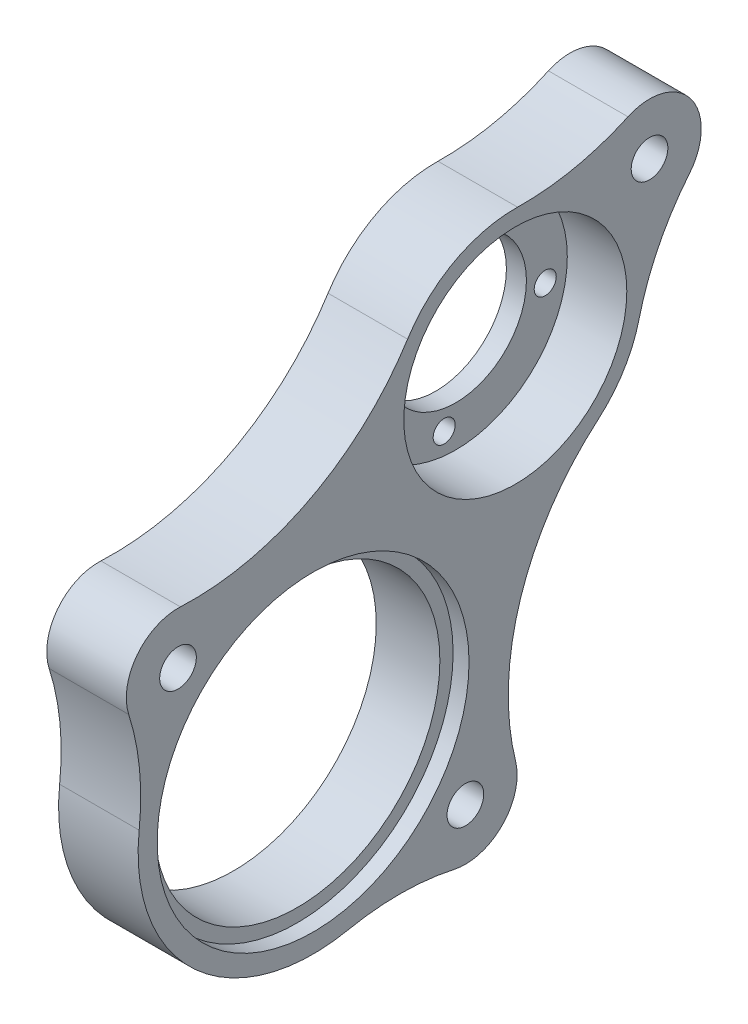
ISO-10303-21;
HEADER;
FILE_DESCRIPTION(('STEP AP214'),'2;1');
FILE_NAME('part.step','',(''),(''),'','','');
FILE_SCHEMA(('AUTOMOTIVE_DESIGN { 1 0 10303 214 1 1 1 1 }'));
ENDSEC;
DATA;
#1=APPLICATION_CONTEXT('core data for automotive mechanical design processes');
#2=APPLICATION_PROTOCOL_DEFINITION('international standard','automotive_design',2000,#1);
#3=PRODUCT_CONTEXT('',#1,'mechanical');
#4=PRODUCT('Part','Part','',(#3));
#5=PRODUCT_RELATED_PRODUCT_CATEGORY('part','',(#4));
#6=PRODUCT_DEFINITION_FORMATION('','',#4);
#7=PRODUCT_DEFINITION_CONTEXT('part definition',#1,'design');
#8=PRODUCT_DEFINITION('design','',#6,#7);
#9=PRODUCT_DEFINITION_SHAPE('','',#8);
#10=(LENGTH_UNIT() NAMED_UNIT(*) SI_UNIT(.MILLI.,.METRE.));
#11=(NAMED_UNIT(*) PLANE_ANGLE_UNIT() SI_UNIT($,.RADIAN.));
#12=(NAMED_UNIT(*) SI_UNIT($,.STERADIAN.) SOLID_ANGLE_UNIT());
#13=UNCERTAINTY_MEASURE_WITH_UNIT(LENGTH_MEASURE(1.E-05),#10,'distance_accuracy_value','');
#14=(GEOMETRIC_REPRESENTATION_CONTEXT(3) GLOBAL_UNCERTAINTY_ASSIGNED_CONTEXT((#13)) GLOBAL_UNIT_ASSIGNED_CONTEXT((#10,
#11,#12)) REPRESENTATION_CONTEXT('',''));
#15=CARTESIAN_POINT('',(0.,0.,0.));
#16=DIRECTION('',(0.,0.,1.));
#17=DIRECTION('',(1.,0.,0.));
#18=AXIS2_PLACEMENT_3D('',#15,#16,#17);
#19=CARTESIAN_POINT('',(-54.0385,40.64,-145.269790757238));
#20=DIRECTION('',(1.,0.,0.));
#21=DIRECTION('',(0.,0.,-1.));
#22=AXIS2_PLACEMENT_3D('',#19,#20,#21);
#23=CYLINDRICAL_SURFACE('',#22,14.2367);
#24=CARTESIAN_POINT('',(-54.0385,40.64,-145.269790757238));
#25=DIRECTION('',(-1.,0.,0.));
#26=DIRECTION('',(0.,0.,1.));
#27=AXIS2_PLACEMENT_3D('',#24,#25,#26);
#28=CIRCLE('',#27,14.2367);
#29=CARTESIAN_POINT('',(-54.0385,40.64,-131.033090757238));
#30=VERTEX_POINT('',#29);
#31=EDGE_CURVE('E272',#30,#30,#28,.T.);
#32=ORIENTED_EDGE('',*,*,#31,.T.);
#33=EDGE_LOOP('',(#32));
#34=FACE_BOUND('',#33,.T.);
#35=CARTESIAN_POINT('',(-47.6885,40.64,-145.269790757238));
#36=DIRECTION('',(1.,0.,0.));
#37=DIRECTION('',(0.,0.,-1.));
#38=AXIS2_PLACEMENT_3D('',#35,#36,#37);
#39=CIRCLE('',#38,14.2367);
#40=CARTESIAN_POINT('',(-47.6885,40.64,-159.506490757238));
#41=VERTEX_POINT('',#40);
#42=EDGE_CURVE('E134',#41,#41,#39,.T.);
#43=ORIENTED_EDGE('',*,*,#42,.T.);
#44=EDGE_LOOP('',(#43));
#45=FACE_BOUND('',#44,.T.);
#46=ADVANCED_FACE('F130',(#34,#45),#23,.F.);
#47=CARTESIAN_POINT('',(-54.0385,73.7443887278039,-166.600663475272));
#48=DIRECTION('',(1.,0.,0.));
#49=DIRECTION('',(0.,0.,-1.));
#50=AXIS2_PLACEMENT_3D('',#47,#48,#49);
#51=CYLINDRICAL_SURFACE('',#50,1.09999999999988);
#52=CARTESIAN_POINT('',(-54.0385,73.7443887278039,-166.600663475272));
#53=DIRECTION('',(-1.,0.,0.));
#54=DIRECTION('',(0.,0.,1.));
#55=AXIS2_PLACEMENT_3D('',#52,#53,#54);
#56=CIRCLE('',#55,1.09999999999988);
#57=CARTESIAN_POINT('',(-54.0385,73.7443887278039,-165.500663475272));
#58=VERTEX_POINT('',#57);
#59=EDGE_CURVE('E284',#58,#58,#56,.T.);
#60=ORIENTED_EDGE('',*,*,#59,.T.);
#61=EDGE_LOOP('',(#60));
#62=FACE_BOUND('',#61,.T.);
#63=CARTESIAN_POINT('',(-52.0385,73.7443887278039,-166.600663475272));
#64=DIRECTION('',(1.,0.,0.));
#65=DIRECTION('',(0.,0.,-1.));
#66=AXIS2_PLACEMENT_3D('',#63,#64,#65);
#67=CIRCLE('',#66,1.09999999999988);
#68=CARTESIAN_POINT('',(-52.0385,73.7443887278039,-167.700663475272));
#69=VERTEX_POINT('',#68);
#70=EDGE_CURVE('E254',#69,#69,#67,.T.);
#71=ORIENTED_EDGE('',*,*,#70,.T.);
#72=EDGE_LOOP('',(#71));
#73=FACE_BOUND('',#72,.T.);
#74=ADVANCED_FACE('F395',(#62,#73),#51,.F.);
#75=CARTESIAN_POINT('',(-54.0385,63.6625242944224,-174.369576497499));
#76=DIRECTION('',(1.,0.,0.));
#77=DIRECTION('',(0.,0.,-1.));
#78=AXIS2_PLACEMENT_3D('',#75,#76,#77);
#79=CYLINDRICAL_SURFACE('',#78,1.09999999999999);
#80=CARTESIAN_POINT('',(-54.0385,63.6625242944224,-174.369576497499));
#81=DIRECTION('',(-1.,0.,0.));
#82=DIRECTION('',(0.,0.,1.));
#83=AXIS2_PLACEMENT_3D('',#80,#81,#82);
#84=CIRCLE('',#83,1.09999999999999);
#85=CARTESIAN_POINT('',(-54.0385,63.6625242944224,-173.269576497499));
#86=VERTEX_POINT('',#85);
#87=EDGE_CURVE('E281',#86,#86,#84,.T.);
#88=ORIENTED_EDGE('',*,*,#87,.T.);
#89=EDGE_LOOP('',(#88));
#90=FACE_BOUND('',#89,.T.);
#91=CARTESIAN_POINT('',(-52.0385,63.6625242944224,-174.369576497499));
#92=DIRECTION('',(1.,0.,0.));
#93=DIRECTION('',(0.,0.,-1.));
#94=AXIS2_PLACEMENT_3D('',#91,#92,#93);
#95=CIRCLE('',#94,1.09999999999999);
#96=CARTESIAN_POINT('',(-52.0385,63.6625242944224,-175.469576497499));
#97=VERTEX_POINT('',#96);
#98=EDGE_CURVE('E388',#97,#97,#95,.T.);
#99=ORIENTED_EDGE('',*,*,#98,.T.);
#100=EDGE_LOOP('',(#99));
#101=FACE_BOUND('',#100,.T.);
#102=ADVANCED_FACE('F474',(#90,#101),#79,.F.);
#103=CARTESIAN_POINT('',(-54.0385,55.8936112721961,-164.287712064117));
#104=DIRECTION('',(1.,0.,0.));
#105=DIRECTION('',(0.,0.,-1.));
#106=AXIS2_PLACEMENT_3D('',#103,#104,#105);
#107=CYLINDRICAL_SURFACE('',#106,1.09999999999964);
#108=CARTESIAN_POINT('',(-54.0385,55.8936112721961,-164.287712064117));
#109=DIRECTION('',(-1.,0.,0.));
#110=DIRECTION('',(0.,0.,1.));
#111=AXIS2_PLACEMENT_3D('',#108,#109,#110);
#112=CIRCLE('',#111,1.09999999999964);
#113=CARTESIAN_POINT('',(-54.0385,55.8936112721961,-163.187712064117));
#114=VERTEX_POINT('',#113);
#115=EDGE_CURVE('E278',#114,#114,#112,.T.);
#116=ORIENTED_EDGE('',*,*,#115,.T.);
#117=EDGE_LOOP('',(#116));
#118=FACE_BOUND('',#117,.T.);
#119=CARTESIAN_POINT('',(-52.0385,55.8936112721961,-164.287712064117));
#120=DIRECTION('',(1.,0.,0.));
#121=DIRECTION('',(0.,0.,-1.));
#122=AXIS2_PLACEMENT_3D('',#119,#120,#121);
#123=CIRCLE('',#122,1.09999999999964);
#124=CARTESIAN_POINT('',(-52.0385,55.8936112721961,-165.387712064117));
#125=VERTEX_POINT('',#124);
#126=EDGE_CURVE('E386',#125,#125,#123,.T.);
#127=ORIENTED_EDGE('',*,*,#126,.T.);
#128=EDGE_LOOP('',(#127));
#129=FACE_BOUND('',#128,.T.);
#130=ADVANCED_FACE('F483',(#118,#129),#107,.F.);
#131=CARTESIAN_POINT('',(-54.0385,65.9754757055776,-156.518799041891));
#132=DIRECTION('',(1.,0.,0.));
#133=DIRECTION('',(0.,0.,-1.));
#134=AXIS2_PLACEMENT_3D('',#131,#132,#133);
#135=CYLINDRICAL_SURFACE('',#134,1.10000000000011);
#136=CARTESIAN_POINT('',(-54.0385,65.9754757055776,-156.518799041891));
#137=DIRECTION('',(-1.,0.,0.));
#138=DIRECTION('',(0.,0.,1.));
#139=AXIS2_PLACEMENT_3D('',#136,#137,#138);
#140=CIRCLE('',#139,1.10000000000011);
#141=CARTESIAN_POINT('',(-54.0385,65.9754757055776,-155.418799041891));
#142=VERTEX_POINT('',#141);
#143=EDGE_CURVE('E275',#142,#142,#140,.T.);
#144=ORIENTED_EDGE('',*,*,#143,.T.);
#145=EDGE_LOOP('',(#144));
#146=FACE_BOUND('',#145,.T.);
#147=CARTESIAN_POINT('',(-52.0385,65.9754757055776,-156.518799041891));
#148=DIRECTION('',(1.,0.,0.));
#149=DIRECTION('',(0.,0.,-1.));
#150=AXIS2_PLACEMENT_3D('',#147,#148,#149);
#151=CIRCLE('',#150,1.10000000000011);
#152=CARTESIAN_POINT('',(-52.0385,65.9754757055776,-157.618799041891));
#153=VERTEX_POINT('',#152);
#154=EDGE_CURVE('E339',#153,#153,#151,.T.);
#155=ORIENTED_EDGE('',*,*,#154,.T.);
#156=EDGE_LOOP('',(#155));
#157=FACE_BOUND('',#156,.T.);
#158=ADVANCED_FACE('F479',(#146,#157),#135,.F.);
#159=CARTESIAN_POINT('',(-54.0385,64.819,-165.444187769695));
#160=DIRECTION('',(1.,0.,0.));
#161=DIRECTION('',(0.,0.,-1.));
#162=AXIS2_PLACEMENT_3D('',#159,#160,#161);
#163=CYLINDRICAL_SURFACE('',#162,7.05000000000001);
#164=CARTESIAN_POINT('',(-54.0385,64.819,-165.444187769695));
#165=DIRECTION('',(-1.,0.,0.));
#166=DIRECTION('',(0.,0.,1.));
#167=AXIS2_PLACEMENT_3D('',#164,#165,#166);
#168=CIRCLE('',#167,7.05000000000001);
#169=CARTESIAN_POINT('',(-54.0385,64.819,-158.394187769695));
#170=VERTEX_POINT('',#169);
#171=EDGE_CURVE('E287',#170,#170,#168,.T.);
#172=ORIENTED_EDGE('',*,*,#171,.T.);
#173=EDGE_LOOP('',(#172));
#174=FACE_BOUND('',#173,.T.);
#175=CARTESIAN_POINT('',(-52.0385,64.819,-165.444187769695));
#176=DIRECTION('',(1.,0.,0.));
#177=DIRECTION('',(0.,0.,-1.));
#178=AXIS2_PLACEMENT_3D('',#175,#176,#177);
#179=CIRCLE('',#178,7.05000000000001);
#180=CARTESIAN_POINT('',(-52.0385,64.819,-172.494187769695));
#181=VERTEX_POINT('',#180);
#182=EDGE_CURVE('E336',#181,#181,#179,.T.);
#183=ORIENTED_EDGE('',*,*,#182,.T.);
#184=EDGE_LOOP('',(#183));
#185=FACE_BOUND('',#184,.T.);
#186=ADVANCED_FACE('F482',(#174,#185),#163,.F.);
#187=CARTESIAN_POINT('',(-54.0385,102.927516376853,-166.119531982018));
#188=DIRECTION('',(1.,0.,0.));
#189=DIRECTION('',(0.,0.,-1.));
#190=AXIS2_PLACEMENT_3D('',#187,#188,#189);
#191=CYLINDRICAL_SURFACE('',#190,25.4);
#192=CARTESIAN_POINT('',(-46.101,102.927516376853,-166.119531982018));
#193=DIRECTION('',(-1.,0.,0.));
#194=DIRECTION('',(0.,0.,1.));
#195=AXIS2_PLACEMENT_3D('',#192,#193,#194);
#196=CIRCLE('',#195,25.4);
#197=CARTESIAN_POINT('',(-46.101,79.8315047599697,-176.689974138938));
#198=VERTEX_POINT('',#197);
#199=CARTESIAN_POINT('',(-46.101,77.531503941374,-165.669473789125));
#200=VERTEX_POINT('',#199);
#201=EDGE_CURVE('E227',#198,#200,#196,.T.);
#202=ORIENTED_EDGE('',*,*,#201,.F.);
#203=DIRECTION('',(1.,0.,0.));
#204=VECTOR('',#203,1.);
#205=CARTESIAN_POINT('',(-54.0385,79.8315047599697,-176.689974138938));
#206=LINE('',#205,#204);
#207=CARTESIAN_POINT('',(-54.0385,79.8315047599697,-176.689974138938));
#208=VERTEX_POINT('',#207);
#209=EDGE_CURVE('E221',#208,#198,#206,.T.);
#210=ORIENTED_EDGE('',*,*,#209,.F.);
#211=CARTESIAN_POINT('',(-54.0385,102.927516376853,-166.119531982018));
#212=DIRECTION('',(-1.,0.,0.));
#213=DIRECTION('',(0.,0.,1.));
#214=AXIS2_PLACEMENT_3D('',#211,#212,#213);
#215=CIRCLE('',#214,25.4);
#216=CARTESIAN_POINT('',(-54.0385,77.531503941374,-165.669473789125));
#217=VERTEX_POINT('',#216);
#218=EDGE_CURVE('E225',#208,#217,#215,.T.);
#219=ORIENTED_EDGE('',*,*,#218,.T.);
#220=DIRECTION('',(1.,0.,0.));
#221=VECTOR('',#220,1.);
#222=CARTESIAN_POINT('',(-54.0385,77.531503941374,-165.669473789125));
#223=LINE('',#222,#221);
#224=EDGE_CURVE('E290',#217,#200,#223,.T.);
#225=ORIENTED_EDGE('',*,*,#224,.T.);
#226=EDGE_LOOP('',(#202,#210,#219,#225));
#227=FACE_BOUND('',#226,.T.);
#228=ADVANCED_FACE('F223',(#227),#191,.F.);
#229=CARTESIAN_POINT('',(-54.0385,75.1395499999999,-178.837359463116));
#230=DIRECTION('',(1.,0.,0.));
#231=DIRECTION('',(0.,0.,-1.));
#232=AXIS2_PLACEMENT_3D('',#229,#230,#231);
#233=CYLINDRICAL_SURFACE('',#232,5.16000999999998);
#234=CARTESIAN_POINT('',(-46.101,75.1395499999999,-178.837359463116));
#235=DIRECTION('',(-1.,0.,0.));
#236=DIRECTION('',(0.,0.,1.));
#237=AXIS2_PLACEMENT_3D('',#234,#235,#236);
#238=CIRCLE('',#237,5.16000999999998);
#239=CARTESIAN_POINT('',(-46.101,71.8672672912918,-182.827079888709));
#240=VERTEX_POINT('',#239);
#241=EDGE_CURVE('E292',#198,#240,#238,.T.);
#242=ORIENTED_EDGE('',*,*,#241,.T.);
#243=DIRECTION('',(1.,0.,0.));
#244=VECTOR('',#243,1.);
#245=CARTESIAN_POINT('',(-54.0385,71.8672672912918,-182.827079888709));
#246=LINE('',#245,#244);
#247=CARTESIAN_POINT('',(-54.0385,71.8672672912918,-182.827079888709));
#248=VERTEX_POINT('',#247);
#249=EDGE_CURVE('E231',#248,#240,#246,.T.);
#250=ORIENTED_EDGE('',*,*,#249,.F.);
#251=CARTESIAN_POINT('',(-54.0385,75.1395499999999,-178.837359463116));
#252=DIRECTION('',(-1.,0.,0.));
#253=DIRECTION('',(0.,0.,1.));
#254=AXIS2_PLACEMENT_3D('',#251,#252,#253);
#255=CIRCLE('',#254,5.16000999999998);
#256=EDGE_CURVE('E234',#208,#248,#255,.T.);
#257=ORIENTED_EDGE('',*,*,#256,.F.);
#258=ORIENTED_EDGE('',*,*,#209,.T.);
#259=EDGE_LOOP('',(#242,#250,#257,#258));
#260=FACE_BOUND('',#259,.T.);
#261=ADVANCED_FACE('F235',(#260),#233,.T.);
#262=CARTESIAN_POINT('',(-54.0385,55.7595502905134,-202.466363302898));
#263=DIRECTION('',(1.,0.,0.));
#264=DIRECTION('',(0.,0.,-1.));
#265=AXIS2_PLACEMENT_3D('',#262,#263,#264);
#266=CYLINDRICAL_SURFACE('',#265,25.4);
#267=CARTESIAN_POINT('',(-46.101,55.7595502905134,-202.466363302898));
#268=DIRECTION('',(-1.,0.,0.));
#269=DIRECTION('',(0.,0.,1.));
#270=AXIS2_PLACEMENT_3D('',#267,#268,#269);
#271=CIRCLE('',#270,25.4);
#272=CARTESIAN_POINT('',(-46.101,61.7968857565686,-177.794302576839));
#273=VERTEX_POINT('',#272);
#274=EDGE_CURVE('E294',#240,#273,#271,.F.);
#275=ORIENTED_EDGE('',*,*,#274,.T.);
#276=DIRECTION('',(1.,0.,0.));
#277=VECTOR('',#276,1.);
#278=CARTESIAN_POINT('',(-54.0385,61.7968857565686,-177.794302576839));
#279=LINE('',#278,#277);
#280=CARTESIAN_POINT('',(-54.0385,61.7968857565686,-177.794302576839));
#281=VERTEX_POINT('',#280);
#282=EDGE_CURVE('E319',#281,#273,#279,.T.);
#283=ORIENTED_EDGE('',*,*,#282,.F.);
#284=CARTESIAN_POINT('',(-54.0385,55.7595502905134,-202.466363302898));
#285=DIRECTION('',(-1.,0.,0.));
#286=DIRECTION('',(0.,0.,1.));
#287=AXIS2_PLACEMENT_3D('',#284,#285,#286);
#288=CIRCLE('',#287,25.4);
#289=EDGE_CURVE('E239',#248,#281,#288,.F.);
#290=ORIENTED_EDGE('',*,*,#289,.F.);
#291=ORIENTED_EDGE('',*,*,#249,.T.);
#292=EDGE_LOOP('',(#275,#283,#290,#291));
#293=FACE_BOUND('',#292,.T.);
#294=ADVANCED_FACE('F427',(#293),#266,.F.);
#295=CARTESIAN_POINT('',(-54.0385,64.819,-165.444187769695));
#296=DIRECTION('',(1.,0.,0.));
#297=DIRECTION('',(0.,0.,-1.));
#298=AXIS2_PLACEMENT_3D('',#295,#296,#297);
#299=CYLINDRICAL_SURFACE('',#298,12.7145);
#300=CARTESIAN_POINT('',(-46.101,64.819,-165.444187769695));
#301=DIRECTION('',(-1.,0.,0.));
#302=DIRECTION('',(0.,0.,1.));
#303=AXIS2_PLACEMENT_3D('',#300,#301,#302);
#304=CIRCLE('',#303,12.7145);
#305=CARTESIAN_POINT('',(-46.101,55.1351963431537,-173.683268846226));
#306=VERTEX_POINT('',#305);
#307=EDGE_CURVE('E252',#273,#306,#304,.T.);
#308=ORIENTED_EDGE('',*,*,#307,.T.);
#309=DIRECTION('',(1.,0.,0.));
#310=VECTOR('',#309,1.);
#311=CARTESIAN_POINT('',(-54.0385,55.1351963431537,-173.683268846226));
#312=LINE('',#311,#310);
#313=CARTESIAN_POINT('',(-54.0385,55.1351963431537,-173.683268846226));
#314=VERTEX_POINT('',#313);
#315=EDGE_CURVE('E316',#314,#306,#312,.T.);
#316=ORIENTED_EDGE('',*,*,#315,.F.);
#317=CARTESIAN_POINT('',(-54.0385,64.819,-165.444187769695));
#318=DIRECTION('',(-1.,0.,0.));
#319=DIRECTION('',(0.,0.,1.));
#320=AXIS2_PLACEMENT_3D('',#317,#318,#319);
#321=CIRCLE('',#320,12.7145);
#322=EDGE_CURVE('E258',#281,#314,#321,.T.);
#323=ORIENTED_EDGE('',*,*,#322,.F.);
#324=ORIENTED_EDGE('',*,*,#282,.T.);
#325=EDGE_LOOP('',(#308,#316,#323,#324));
#326=FACE_BOUND('',#325,.T.);
#327=ADVANCED_FACE('F434',(#326),#299,.T.);
#328=CARTESIAN_POINT('',(-54.0385,35.7896764340816,-190.14263880524));
#329=DIRECTION('',(1.,0.,0.));
#330=DIRECTION('',(0.,0.,-1.));
#331=AXIS2_PLACEMENT_3D('',#328,#329,#330);
#332=CYLINDRICAL_SURFACE('',#331,25.4);
#333=CARTESIAN_POINT('',(-46.101,35.7896764340816,-190.14263880524));
#334=DIRECTION('',(-1.,0.,0.));
#335=DIRECTION('',(0.,0.,1.));
#336=AXIS2_PLACEMENT_3D('',#333,#334,#335);
#337=CIRCLE('',#336,25.4);
#338=CARTESIAN_POINT('',(-46.101,29.732471235992,-165.475448750671));
#339=VERTEX_POINT('',#338);
#340=EDGE_CURVE('E296',#306,#339,#337,.F.);
#341=ORIENTED_EDGE('',*,*,#340,.T.);
#342=DIRECTION('',(1.,0.,0.));
#343=VECTOR('',#342,1.);
#344=CARTESIAN_POINT('',(-54.0385,29.732471235992,-165.475448750671));
#345=LINE('',#344,#343);
#346=CARTESIAN_POINT('',(-54.0385,29.732471235992,-165.475448750671));
#347=VERTEX_POINT('',#346);
#348=EDGE_CURVE('E313',#347,#339,#345,.T.);
#349=ORIENTED_EDGE('',*,*,#348,.F.);
#350=CARTESIAN_POINT('',(-54.0385,35.7896764340816,-190.14263880524));
#351=DIRECTION('',(-1.,0.,0.));
#352=DIRECTION('',(0.,0.,1.));
#353=AXIS2_PLACEMENT_3D('',#350,#351,#352);
#354=CIRCLE('',#353,25.4);
#355=EDGE_CURVE('E260',#314,#347,#354,.F.);
#356=ORIENTED_EDGE('',*,*,#355,.F.);
#357=ORIENTED_EDGE('',*,*,#315,.T.);
#358=EDGE_LOOP('',(#341,#349,#356,#357));
#359=FACE_BOUND('',#358,.T.);
#360=ADVANCED_FACE('F437',(#359),#332,.F.);
#361=CARTESIAN_POINT('',(-54.0385,28.5019500000001,-160.464309091085));
#362=DIRECTION('',(1.,0.,0.));
#363=DIRECTION('',(0.,0.,-1.));
#364=AXIS2_PLACEMENT_3D('',#361,#362,#363);
#365=CYLINDRICAL_SURFACE('',#364,5.16000999999998);
#366=CARTESIAN_POINT('',(-46.101,28.5019500000001,-160.464309091085));
#367=DIRECTION('',(-1.,0.,0.));
#368=DIRECTION('',(0.,0.,1.));
#369=AXIS2_PLACEMENT_3D('',#366,#367,#368);
#370=CIRCLE('',#369,5.16000999999998);
#371=CARTESIAN_POINT('',(-46.101,23.462389320862,-159.355917751627));
#372=VERTEX_POINT('',#371);
#373=EDGE_CURVE('E298',#339,#372,#370,.T.);
#374=ORIENTED_EDGE('',*,*,#373,.T.);
#375=DIRECTION('',(1.,0.,0.));
#376=VECTOR('',#375,1.);
#377=CARTESIAN_POINT('',(-54.0385,23.462389320862,-159.355917751627));
#378=LINE('',#377,#376);
#379=CARTESIAN_POINT('',(-54.0385,23.462389320862,-159.355917751627));
#380=VERTEX_POINT('',#379);
#381=EDGE_CURVE('E147',#372,#380,#378,.F.);
#382=ORIENTED_EDGE('',*,*,#381,.T.);
#383=CARTESIAN_POINT('',(-54.0385,28.5019500000001,-160.464309091085));
#384=DIRECTION('',(-1.,0.,0.));
#385=DIRECTION('',(0.,0.,1.));
#386=AXIS2_PLACEMENT_3D('',#383,#384,#385);
#387=CIRCLE('',#386,5.16000999999998);
#388=EDGE_CURVE('E262',#347,#380,#387,.T.);
#389=ORIENTED_EDGE('',*,*,#388,.F.);
#390=ORIENTED_EDGE('',*,*,#348,.T.);
#391=EDGE_LOOP('',(#374,#382,#389,#390));
#392=FACE_BOUND('',#391,.T.);
#393=ADVANCED_FACE('F438',(#392),#365,.T.);
#394=CARTESIAN_POINT('',(-54.0385,40.64,-145.269790757238));
#395=DIRECTION('',(1.,0.,0.));
#396=DIRECTION('',(0.,0.,-1.));
#397=AXIS2_PLACEMENT_3D('',#394,#395,#396);
#398=CYLINDRICAL_SURFACE('',#397,17.4625);
#399=CARTESIAN_POINT('',(-46.101,40.64,-145.269790757238));
#400=DIRECTION('',(-1.,0.,0.));
#401=DIRECTION('',(0.,0.,1.));
#402=AXIS2_PLACEMENT_3D('',#399,#400,#401);
#403=CIRCLE('',#402,17.4625);
#404=CARTESIAN_POINT('',(-46.101,23.5351212523761,-148.785758515777));
#405=VERTEX_POINT('',#404);
#406=CARTESIAN_POINT('',(-46.101,42.5716407893494,-127.914455263191));
#407=VERTEX_POINT('',#406);
#408=EDGE_CURVE('E300',#405,#407,#403,.T.);
#409=ORIENTED_EDGE('',*,*,#408,.T.);
#410=DIRECTION('',(1.,0.,0.));
#411=VECTOR('',#410,1.);
#412=CARTESIAN_POINT('',(-54.0385,42.5716407893494,-127.914455263191));
#413=LINE('',#412,#411);
#414=CARTESIAN_POINT('',(-54.0385,42.5716407893494,-127.914455263191));
#415=VERTEX_POINT('',#414);
#416=EDGE_CURVE('E328',#407,#415,#413,.F.);
#417=ORIENTED_EDGE('',*,*,#416,.T.);
#418=CARTESIAN_POINT('',(-54.0385,40.64,-145.269790757238));
#419=DIRECTION('',(-1.,0.,0.));
#420=DIRECTION('',(0.,0.,1.));
#421=AXIS2_PLACEMENT_3D('',#418,#419,#420);
#422=CIRCLE('',#421,17.4625);
#423=CARTESIAN_POINT('',(-54.0385,23.5351212523761,-148.785758515777));
#424=VERTEX_POINT('',#423);
#425=EDGE_CURVE('E264',#424,#415,#422,.T.);
#426=ORIENTED_EDGE('',*,*,#425,.F.);
#427=DIRECTION('',(1.,0.,0.));
#428=VECTOR('',#427,1.);
#429=CARTESIAN_POINT('',(-54.0385,23.5351212523761,-148.785758515777));
#430=LINE('',#429,#428);
#431=EDGE_CURVE('E325',#424,#405,#430,.T.);
#432=ORIENTED_EDGE('',*,*,#431,.T.);
#433=EDGE_LOOP('',(#409,#417,#426,#432));
#434=FACE_BOUND('',#433,.T.);
#435=ADVANCED_FACE('F444',(#434),#398,.T.);
#436=CARTESIAN_POINT('',(-54.0385,54.6566663689196,-131.788740757238));
#437=DIRECTION('',(1.,0.,0.));
#438=DIRECTION('',(0.,0.,-1.));
#439=AXIS2_PLACEMENT_3D('',#436,#437,#438);
#440=CYLINDRICAL_SURFACE('',#439,5.16000999999998);
#441=CARTESIAN_POINT('',(-54.0385,54.6566663689196,-131.788740757238));
#442=DIRECTION('',(-1.,0.,0.));
#443=DIRECTION('',(0.,0.,1.));
#444=AXIS2_PLACEMENT_3D('',#441,#442,#443);
#445=CIRCLE('',#444,5.16000999999998);
#446=CARTESIAN_POINT('',(-54.0385,53.0905352517624,-126.872142693132));
#447=VERTEX_POINT('',#446);
#448=CARTESIAN_POINT('',(-54.0385,59.8109685261732,-132.031377258678));
#449=VERTEX_POINT('',#448);
#450=EDGE_CURVE('E267',#447,#449,#445,.T.);
#451=ORIENTED_EDGE('',*,*,#450,.F.);
#452=DIRECTION('',(1.,0.,0.));
#453=VECTOR('',#452,1.);
#454=CARTESIAN_POINT('',(-54.0385,53.0905352517624,-126.872142693132));
#455=LINE('',#454,#453);
#456=CARTESIAN_POINT('',(-46.101,53.0905352517624,-126.872142693132));
#457=VERTEX_POINT('',#456);
#458=EDGE_CURVE('E230',#447,#457,#455,.T.);
#459=ORIENTED_EDGE('',*,*,#458,.T.);
#460=CARTESIAN_POINT('',(-46.101,54.6566663689196,-131.788740757238));
#461=DIRECTION('',(-1.,0.,0.));
#462=DIRECTION('',(0.,0.,1.));
#463=AXIS2_PLACEMENT_3D('',#460,#461,#462);
#464=CIRCLE('',#463,5.16000999999998);
#465=CARTESIAN_POINT('',(-46.101,59.8109685261732,-132.031377258678));
#466=VERTEX_POINT('',#465);
#467=EDGE_CURVE('E303',#457,#466,#464,.T.);
#468=ORIENTED_EDGE('',*,*,#467,.T.);
#469=DIRECTION('',(1.,0.,0.));
#470=VECTOR('',#469,1.);
#471=CARTESIAN_POINT('',(-54.0385,59.8109685261732,-132.031377258678));
#472=LINE('',#471,#470);
#473=EDGE_CURVE('E310',#449,#466,#472,.T.);
#474=ORIENTED_EDGE('',*,*,#473,.F.);
#475=EDGE_LOOP('',(#451,#459,#468,#474));
#476=FACE_BOUND('',#475,.T.);
#477=ADVANCED_FACE('F452',(#476),#440,.T.);
#478=CARTESIAN_POINT('',(-54.0385,85.1828718353221,-133.225748420083));
#479=DIRECTION('',(1.,0.,0.));
#480=DIRECTION('',(0.,0.,-1.));
#481=AXIS2_PLACEMENT_3D('',#478,#479,#480);
#482=CYLINDRICAL_SURFACE('',#481,25.4);
#483=CARTESIAN_POINT('',(-46.101,85.1828718353221,-133.225748420083));
#484=DIRECTION('',(-1.,0.,0.));
#485=DIRECTION('',(0.,0.,1.));
#486=AXIS2_PLACEMENT_3D('',#483,#484,#485);
#487=CIRCLE('',#486,25.4);
#488=CARTESIAN_POINT('',(-46.101,71.6121219995068,-154.696536689118));
#489=VERTEX_POINT('',#488);
#490=EDGE_CURVE('E250',#489,#466,#487,.T.);
#491=ORIENTED_EDGE('',*,*,#490,.F.);
#492=DIRECTION('',(1.,0.,0.));
#493=VECTOR('',#492,1.);
#494=CARTESIAN_POINT('',(-54.0385,71.6121219995068,-154.696536689118));
#495=LINE('',#494,#493);
#496=CARTESIAN_POINT('',(-54.0385,71.6121219995068,-154.696536689118));
#497=VERTEX_POINT('',#496);
#498=EDGE_CURVE('E308',#497,#489,#495,.T.);
#499=ORIENTED_EDGE('',*,*,#498,.F.);
#500=CARTESIAN_POINT('',(-54.0385,85.1828718353221,-133.225748420083));
#501=DIRECTION('',(-1.,0.,0.));
#502=DIRECTION('',(0.,0.,1.));
#503=AXIS2_PLACEMENT_3D('',#500,#501,#502);
#504=CIRCLE('',#503,25.4);
#505=EDGE_CURVE('E269',#497,#449,#504,.T.);
#506=ORIENTED_EDGE('',*,*,#505,.T.);
#507=ORIENTED_EDGE('',*,*,#473,.T.);
#508=EDGE_LOOP('',(#491,#499,#506,#507));
#509=FACE_BOUND('',#508,.T.);
#510=ADVANCED_FACE('F455',(#509),#482,.F.);
#511=EDGE_CURVE('E247',#489,#200,#304,.T.);
#512=ORIENTED_EDGE('',*,*,#511,.T.);
#513=ORIENTED_EDGE('',*,*,#224,.F.);
#514=EDGE_CURVE('E245',#497,#217,#321,.T.);
#515=ORIENTED_EDGE('',*,*,#514,.F.);
#516=ORIENTED_EDGE('',*,*,#498,.T.);
#517=EDGE_LOOP('',(#512,#513,#515,#516));
#518=FACE_BOUND('',#517,.T.);
#519=ADVANCED_FACE('F457',(#518),#299,.T.);
#520=CARTESIAN_POINT('',(-54.0385,0.,0.));
#521=DIRECTION('',(-1.,0.,0.));
#522=DIRECTION('',(0.,0.,1.));
#523=AXIS2_PLACEMENT_3D('',#520,#521,#522);
#524=PLANE('',#523);
#525=CARTESIAN_POINT('',(-54.0385,75.1395499999999,-178.837359463116));
#526=DIRECTION('',(-1.,0.,0.));
#527=DIRECTION('',(0.,0.,1.));
#528=AXIS2_PLACEMENT_3D('',#525,#526,#527);
#529=CIRCLE('',#528,3.57251);
#530=CARTESIAN_POINT('',(-54.0385,75.1395499999999,-175.264849463116));
#531=VERTEX_POINT('',#530);
#532=EDGE_CURVE('E365',#531,#531,#529,.T.);
#533=ORIENTED_EDGE('',*,*,#532,.F.);
#534=EDGE_LOOP('',(#533));
#535=FACE_BOUND('',#534,.T.);
#536=CARTESIAN_POINT('',(-54.0385,54.6566663689196,-131.788740757238));
#537=DIRECTION('',(-1.,0.,0.));
#538=DIRECTION('',(0.,0.,1.));
#539=AXIS2_PLACEMENT_3D('',#536,#537,#538);
#540=CIRCLE('',#539,3.57250999999999);
#541=CARTESIAN_POINT('',(-54.0385,54.6566663689196,-128.216230757238));
#542=VERTEX_POINT('',#541);
#543=EDGE_CURVE('E352',#542,#542,#540,.T.);
#544=ORIENTED_EDGE('',*,*,#543,.F.);
#545=EDGE_LOOP('',(#544));
#546=FACE_BOUND('',#545,.T.);
#547=CARTESIAN_POINT('',(-54.0385,28.5019500000001,-160.464309091085));
#548=DIRECTION('',(-1.,0.,0.));
#549=DIRECTION('',(0.,0.,1.));
#550=AXIS2_PLACEMENT_3D('',#547,#548,#549);
#551=CIRCLE('',#550,3.57250999999999);
#552=CARTESIAN_POINT('',(-54.0385,28.5019500000001,-156.891799091085));
#553=VERTEX_POINT('',#552);
#554=EDGE_CURVE('E348',#553,#553,#551,.T.);
#555=ORIENTED_EDGE('',*,*,#554,.F.);
#556=EDGE_LOOP('',(#555));
#557=FACE_BOUND('',#556,.T.);
#558=ORIENTED_EDGE('',*,*,#218,.F.);
#559=ORIENTED_EDGE('',*,*,#256,.T.);
#560=ORIENTED_EDGE('',*,*,#289,.T.);
#561=ORIENTED_EDGE('',*,*,#322,.T.);
#562=ORIENTED_EDGE('',*,*,#355,.T.);
#563=ORIENTED_EDGE('',*,*,#388,.T.);
#564=CARTESIAN_POINT('',(-54.0385,-1.34470238053139,-153.899893437288));
#565=DIRECTION('',(-1.,0.,0.));
#566=DIRECTION('',(0.,0.,1.));
#567=AXIS2_PLACEMENT_3D('',#564,#565,#566);
#568=CIRCLE('',#567,25.4);
#569=EDGE_CURVE('E12',#380,#424,#568,.F.);
#570=ORIENTED_EDGE('',*,*,#569,.T.);
#571=ORIENTED_EDGE('',*,*,#425,.T.);
#572=CARTESIAN_POINT('',(-54.0385,45.3813001193123,-102.670330908214));
#573=DIRECTION('',(-1.,0.,0.));
#574=DIRECTION('',(0.,0.,1.));
#575=AXIS2_PLACEMENT_3D('',#572,#573,#574);
#576=CIRCLE('',#575,25.4);
#577=EDGE_CURVE('E333',#415,#447,#576,.F.);
#578=ORIENTED_EDGE('',*,*,#577,.T.);
#579=ORIENTED_EDGE('',*,*,#450,.T.);
#580=ORIENTED_EDGE('',*,*,#505,.F.);
#581=ORIENTED_EDGE('',*,*,#514,.T.);
#582=EDGE_LOOP('',(#558,#559,#560,#561,#562,#563,#570,#571,#578,#579,#580,#581));
#583=FACE_BOUND('',#582,.T.);
#584=ORIENTED_EDGE('',*,*,#31,.F.);
#585=EDGE_LOOP('',(#584));
#586=FACE_BOUND('',#585,.T.);
#587=ORIENTED_EDGE('',*,*,#143,.F.);
#588=EDGE_LOOP('',(#587));
#589=FACE_BOUND('',#588,.T.);
#590=ORIENTED_EDGE('',*,*,#115,.F.);
#591=EDGE_LOOP('',(#590));
#592=FACE_BOUND('',#591,.T.);
#593=ORIENTED_EDGE('',*,*,#87,.F.);
#594=EDGE_LOOP('',(#593));
#595=FACE_BOUND('',#594,.T.);
#596=ORIENTED_EDGE('',*,*,#59,.F.);
#597=EDGE_LOOP('',(#596));
#598=FACE_BOUND('',#597,.T.);
#599=ORIENTED_EDGE('',*,*,#171,.F.);
#600=EDGE_LOOP('',(#599));
#601=FACE_BOUND('',#600,.T.);
#602=ADVANCED_FACE('F241',(#535,#546,#557,#583,#586,#589,#592,#595,#598,#601),#524,.T.);
#603=CARTESIAN_POINT('',(-46.101,0.,0.));
#604=DIRECTION('',(-1.,0.,0.));
#605=DIRECTION('',(0.,0.,1.));
#606=AXIS2_PLACEMENT_3D('',#603,#604,#605);
#607=PLANE('',#606);
#608=CARTESIAN_POINT('',(-46.101,40.64,-145.269790757238));
#609=DIRECTION('',(1.,0.,0.));
#610=DIRECTION('',(0.,0.,-1.));
#611=AXIS2_PLACEMENT_3D('',#608,#609,#610);
#612=CIRCLE('',#611,15.5575);
#613=CARTESIAN_POINT('',(-46.101,40.64,-160.827290757238));
#614=VERTEX_POINT('',#613);
#615=EDGE_CURVE('E543',#614,#614,#612,.T.);
#616=ORIENTED_EDGE('',*,*,#615,.F.);
#617=EDGE_LOOP('',(#616));
#618=FACE_BOUND('',#617,.T.);
#619=CARTESIAN_POINT('',(-46.101,75.1395499999999,-178.837359463116));
#620=DIRECTION('',(-1.,0.,0.));
#621=DIRECTION('',(0.,0.,1.));
#622=AXIS2_PLACEMENT_3D('',#619,#620,#621);
#623=CIRCLE('',#622,1.8288);
#624=CARTESIAN_POINT('',(-46.101,75.1395499999999,-177.008559463116));
#625=VERTEX_POINT('',#624);
#626=EDGE_CURVE('E350',#625,#625,#623,.T.);
#627=ORIENTED_EDGE('',*,*,#626,.T.);
#628=EDGE_LOOP('',(#627));
#629=FACE_BOUND('',#628,.T.);
#630=CARTESIAN_POINT('',(-46.101,54.6566663689196,-131.788740757238));
#631=DIRECTION('',(-1.,0.,0.));
#632=DIRECTION('',(0.,0.,1.));
#633=AXIS2_PLACEMENT_3D('',#630,#631,#632);
#634=CIRCLE('',#633,1.8288);
#635=CARTESIAN_POINT('',(-46.101,54.6566663689196,-129.959940757238));
#636=VERTEX_POINT('',#635);
#637=EDGE_CURVE('E346',#636,#636,#634,.T.);
#638=ORIENTED_EDGE('',*,*,#637,.T.);
#639=EDGE_LOOP('',(#638));
#640=FACE_BOUND('',#639,.T.);
#641=CARTESIAN_POINT('',(-46.101,28.5019500000001,-160.464309091085));
#642=DIRECTION('',(-1.,0.,0.));
#643=DIRECTION('',(0.,0.,1.));
#644=AXIS2_PLACEMENT_3D('',#641,#642,#643);
#645=CIRCLE('',#644,1.8288);
#646=CARTESIAN_POINT('',(-46.101,28.5019500000001,-158.635509091085));
#647=VERTEX_POINT('',#646);
#648=EDGE_CURVE('E341',#647,#647,#645,.T.);
#649=ORIENTED_EDGE('',*,*,#648,.T.);
#650=EDGE_LOOP('',(#649));
#651=FACE_BOUND('',#650,.T.);
#652=CARTESIAN_POINT('',(-46.101,64.819,-165.444187769695));
#653=DIRECTION('',(1.,0.,0.));
#654=DIRECTION('',(0.,0.,-1.));
#655=AXIS2_PLACEMENT_3D('',#652,#653,#654);
#656=CIRCLE('',#655,11.127);
#657=CARTESIAN_POINT('',(-46.101,64.819,-176.571187769695));
#658=VERTEX_POINT('',#657);
#659=EDGE_CURVE('E344',#658,#658,#656,.T.);
#660=ORIENTED_EDGE('',*,*,#659,.F.);
#661=EDGE_LOOP('',(#660));
#662=FACE_BOUND('',#661,.T.);
#663=ORIENTED_EDGE('',*,*,#201,.T.);
#664=ORIENTED_EDGE('',*,*,#511,.F.);
#665=ORIENTED_EDGE('',*,*,#490,.T.);
#666=ORIENTED_EDGE('',*,*,#467,.F.);
#667=CARTESIAN_POINT('',(-46.101,45.3813001193123,-102.670330908214));
#668=DIRECTION('',(-1.,0.,0.));
#669=DIRECTION('',(0.,0.,1.));
#670=AXIS2_PLACEMENT_3D('',#667,#668,#669);
#671=CIRCLE('',#670,25.4);
#672=EDGE_CURVE('E331',#457,#407,#671,.T.);
#673=ORIENTED_EDGE('',*,*,#672,.T.);
#674=ORIENTED_EDGE('',*,*,#408,.F.);
#675=CARTESIAN_POINT('',(-46.101,-1.34470238053139,-153.899893437288));
#676=DIRECTION('',(-1.,0.,0.));
#677=DIRECTION('',(0.,0.,1.));
#678=AXIS2_PLACEMENT_3D('',#675,#676,#677);
#679=CIRCLE('',#678,25.4);
#680=EDGE_CURVE('E139',#405,#372,#679,.T.);
#681=ORIENTED_EDGE('',*,*,#680,.T.);
#682=ORIENTED_EDGE('',*,*,#373,.F.);
#683=ORIENTED_EDGE('',*,*,#340,.F.);
#684=ORIENTED_EDGE('',*,*,#307,.F.);
#685=ORIENTED_EDGE('',*,*,#274,.F.);
#686=ORIENTED_EDGE('',*,*,#241,.F.);
#687=EDGE_LOOP('',(#663,#664,#665,#666,#673,#674,#681,#682,#683,#684,#685,#686));
#688=FACE_BOUND('',#687,.T.);
#689=ADVANCED_FACE('F417',(#618,#629,#640,#651,#662,#688),#607,.F.);
#690=CARTESIAN_POINT('',(-54.0385,45.3813001193123,-102.670330908214));
#691=DIRECTION('',(-1.,0.,0.));
#692=DIRECTION('',(0.,0.,1.));
#693=AXIS2_PLACEMENT_3D('',#690,#691,#692);
#694=CYLINDRICAL_SURFACE('',#693,25.4);
#695=ORIENTED_EDGE('',*,*,#577,.F.);
#696=ORIENTED_EDGE('',*,*,#416,.F.);
#697=ORIENTED_EDGE('',*,*,#672,.F.);
#698=ORIENTED_EDGE('',*,*,#458,.F.);
#699=EDGE_LOOP('',(#695,#696,#697,#698));
#700=FACE_BOUND('',#699,.T.);
#701=ADVANCED_FACE('F419',(#700),#694,.F.);
#702=CARTESIAN_POINT('',(-54.0385,-1.34470238053139,-153.899893437288));
#703=DIRECTION('',(-1.,0.,0.));
#704=DIRECTION('',(0.,0.,1.));
#705=AXIS2_PLACEMENT_3D('',#702,#703,#704);
#706=CYLINDRICAL_SURFACE('',#705,25.4);
#707=ORIENTED_EDGE('',*,*,#569,.F.);
#708=ORIENTED_EDGE('',*,*,#381,.F.);
#709=ORIENTED_EDGE('',*,*,#680,.F.);
#710=ORIENTED_EDGE('',*,*,#431,.F.);
#711=EDGE_LOOP('',(#707,#708,#709,#710));
#712=FACE_BOUND('',#711,.T.);
#713=ADVANCED_FACE('F132',(#712),#706,.F.);
#714=CARTESIAN_POINT('',(-52.0385,64.819,-165.444187769695));
#715=DIRECTION('',(1.,0.,0.));
#716=DIRECTION('',(0.,0.,-1.));
#717=AXIS2_PLACEMENT_3D('',#714,#715,#716);
#718=CYLINDRICAL_SURFACE('',#717,11.127);
#719=CARTESIAN_POINT('',(-52.0385,64.819,-165.444187769695));
#720=DIRECTION('',(1.,0.,0.));
#721=DIRECTION('',(0.,0.,-1.));
#722=AXIS2_PLACEMENT_3D('',#719,#720,#721);
#723=CIRCLE('',#722,11.127);
#724=CARTESIAN_POINT('',(-52.0385,64.819,-176.571187769695));
#725=VERTEX_POINT('',#724);
#726=EDGE_CURVE('E340',#725,#725,#723,.T.);
#727=ORIENTED_EDGE('',*,*,#726,.F.);
#728=EDGE_LOOP('',(#727));
#729=FACE_BOUND('',#728,.T.);
#730=ORIENTED_EDGE('',*,*,#659,.T.);
#731=EDGE_LOOP('',(#730));
#732=FACE_BOUND('',#731,.T.);
#733=ADVANCED_FACE('F401',(#729,#732),#718,.F.);
#734=CARTESIAN_POINT('',(-52.0385,64.819,-165.444187769695));
#735=DIRECTION('',(1.,0.,0.));
#736=DIRECTION('',(0.,0.,-1.));
#737=AXIS2_PLACEMENT_3D('',#734,#735,#736);
#738=PLANE('',#737);
#739=ORIENTED_EDGE('',*,*,#70,.F.);
#740=EDGE_LOOP('',(#739));
#741=FACE_BOUND('',#740,.T.);
#742=ORIENTED_EDGE('',*,*,#98,.F.);
#743=EDGE_LOOP('',(#742));
#744=FACE_BOUND('',#743,.T.);
#745=ORIENTED_EDGE('',*,*,#126,.F.);
#746=EDGE_LOOP('',(#745));
#747=FACE_BOUND('',#746,.T.);
#748=ORIENTED_EDGE('',*,*,#154,.F.);
#749=EDGE_LOOP('',(#748));
#750=FACE_BOUND('',#749,.T.);
#751=ORIENTED_EDGE('',*,*,#182,.F.);
#752=EDGE_LOOP('',(#751));
#753=FACE_BOUND('',#752,.T.);
#754=ORIENTED_EDGE('',*,*,#726,.T.);
#755=EDGE_LOOP('',(#754));
#756=FACE_BOUND('',#755,.T.);
#757=ADVANCED_FACE('F397',(#741,#744,#747,#750,#753,#756),#738,.T.);
#758=CARTESIAN_POINT('',(-54.0385,28.5019500000001,-160.464309091085));
#759=DIRECTION('',(-1.,0.,0.));
#760=DIRECTION('',(0.,0.,1.));
#761=AXIS2_PLACEMENT_3D('',#758,#759,#760);
#762=CYLINDRICAL_SURFACE('',#761,1.8288);
#763=CARTESIAN_POINT('',(-50.5333,28.5019500000001,-160.464309091085));
#764=DIRECTION('',(-1.,0.,0.));
#765=DIRECTION('',(0.,0.,1.));
#766=AXIS2_PLACEMENT_3D('',#763,#764,#765);
#767=CIRCLE('',#766,1.8288);
#768=CARTESIAN_POINT('',(-50.5333,28.5019500000001,-158.635509091085));
#769=VERTEX_POINT('',#768);
#770=EDGE_CURVE('E345',#769,#769,#767,.T.);
#771=ORIENTED_EDGE('',*,*,#770,.T.);
#772=EDGE_LOOP('',(#771));
#773=FACE_BOUND('',#772,.T.);
#774=ORIENTED_EDGE('',*,*,#648,.F.);
#775=EDGE_LOOP('',(#774));
#776=FACE_BOUND('',#775,.T.);
#777=ADVANCED_FACE('F400',(#773,#776),#762,.F.);
#778=CARTESIAN_POINT('',(-50.5333,30.3307500000001,-160.464309091085));
#779=DIRECTION('',(1.,0.,0.));
#780=DIRECTION('',(0.,0.,-1.));
#781=AXIS2_PLACEMENT_3D('',#778,#779,#780);
#782=PLANE('',#781);
#783=ORIENTED_EDGE('',*,*,#770,.F.);
#784=EDGE_LOOP('',(#783));
#785=FACE_BOUND('',#784,.T.);
#786=CARTESIAN_POINT('',(-50.5333,28.5019500000001,-160.464309091085));
#787=DIRECTION('',(-1.,0.,0.));
#788=DIRECTION('',(0.,0.,1.));
#789=AXIS2_PLACEMENT_3D('',#786,#787,#788);
#790=CIRCLE('',#789,3.57250999999999);
#791=CARTESIAN_POINT('',(-50.5333,28.5019500000001,-156.891799091085));
#792=VERTEX_POINT('',#791);
#793=EDGE_CURVE('E375',#792,#792,#790,.T.);
#794=ORIENTED_EDGE('',*,*,#793,.T.);
#795=EDGE_LOOP('',(#794));
#796=FACE_BOUND('',#795,.T.);
#797=ADVANCED_FACE('F496',(#785,#796),#782,.F.);
#798=CARTESIAN_POINT('',(-54.0385,28.5019500000001,-160.464309091085));
#799=DIRECTION('',(-1.,0.,0.));
#800=DIRECTION('',(0.,0.,1.));
#801=AXIS2_PLACEMENT_3D('',#798,#799,#800);
#802=CYLINDRICAL_SURFACE('',#801,3.57250999999999);
#803=ORIENTED_EDGE('',*,*,#793,.F.);
#804=EDGE_LOOP('',(#803));
#805=FACE_BOUND('',#804,.T.);
#806=ORIENTED_EDGE('',*,*,#554,.T.);
#807=EDGE_LOOP('',(#806));
#808=FACE_BOUND('',#807,.T.);
#809=ADVANCED_FACE('F500',(#805,#808),#802,.F.);
#810=CARTESIAN_POINT('',(-54.0385,54.6566663689196,-131.788740757238));
#811=DIRECTION('',(-1.,0.,0.));
#812=DIRECTION('',(0.,0.,1.));
#813=AXIS2_PLACEMENT_3D('',#810,#811,#812);
#814=CYLINDRICAL_SURFACE('',#813,1.8288);
#815=CARTESIAN_POINT('',(-50.5333,54.6566663689196,-131.788740757238));
#816=DIRECTION('',(-1.,0.,0.));
#817=DIRECTION('',(0.,0.,1.));
#818=AXIS2_PLACEMENT_3D('',#815,#816,#817);
#819=CIRCLE('',#818,1.8288);
#820=CARTESIAN_POINT('',(-50.5333,54.6566663689196,-129.959940757238));
#821=VERTEX_POINT('',#820);
#822=EDGE_CURVE('E349',#821,#821,#819,.T.);
#823=ORIENTED_EDGE('',*,*,#822,.T.);
#824=EDGE_LOOP('',(#823));
#825=FACE_BOUND('',#824,.T.);
#826=ORIENTED_EDGE('',*,*,#637,.F.);
#827=EDGE_LOOP('',(#826));
#828=FACE_BOUND('',#827,.T.);
#829=ADVANCED_FACE('F504',(#825,#828),#814,.F.);
#830=CARTESIAN_POINT('',(-50.5333,56.4854663689196,-131.788740757238));
#831=DIRECTION('',(1.,0.,0.));
#832=DIRECTION('',(0.,0.,-1.));
#833=AXIS2_PLACEMENT_3D('',#830,#831,#832);
#834=PLANE('',#833);
#835=ORIENTED_EDGE('',*,*,#822,.F.);
#836=EDGE_LOOP('',(#835));
#837=FACE_BOUND('',#836,.T.);
#838=CARTESIAN_POINT('',(-50.5333,54.6566663689196,-131.788740757238));
#839=DIRECTION('',(-1.,0.,0.));
#840=DIRECTION('',(0.,0.,1.));
#841=AXIS2_PLACEMENT_3D('',#838,#839,#840);
#842=CIRCLE('',#841,3.57250999999999);
#843=CARTESIAN_POINT('',(-50.5333,54.6566663689196,-128.216230757238));
#844=VERTEX_POINT('',#843);
#845=EDGE_CURVE('E357',#844,#844,#842,.T.);
#846=ORIENTED_EDGE('',*,*,#845,.T.);
#847=EDGE_LOOP('',(#846));
#848=FACE_BOUND('',#847,.T.);
#849=ADVANCED_FACE('F508',(#837,#848),#834,.F.);
#850=CARTESIAN_POINT('',(-54.0385,54.6566663689196,-131.788740757238));
#851=DIRECTION('',(-1.,0.,0.));
#852=DIRECTION('',(0.,0.,1.));
#853=AXIS2_PLACEMENT_3D('',#850,#851,#852);
#854=CYLINDRICAL_SURFACE('',#853,3.57250999999999);
#855=ORIENTED_EDGE('',*,*,#845,.F.);
#856=EDGE_LOOP('',(#855));
#857=FACE_BOUND('',#856,.T.);
#858=ORIENTED_EDGE('',*,*,#543,.T.);
#859=EDGE_LOOP('',(#858));
#860=FACE_BOUND('',#859,.T.);
#861=ADVANCED_FACE('F512',(#857,#860),#854,.F.);
#862=CARTESIAN_POINT('',(-54.0385,75.1395499999999,-178.837359463116));
#863=DIRECTION('',(-1.,0.,0.));
#864=DIRECTION('',(0.,0.,1.));
#865=AXIS2_PLACEMENT_3D('',#862,#863,#864);
#866=CYLINDRICAL_SURFACE('',#865,1.8288);
#867=CARTESIAN_POINT('',(-50.5333,75.1395499999999,-178.837359463116));
#868=DIRECTION('',(-1.,0.,0.));
#869=DIRECTION('',(0.,0.,1.));
#870=AXIS2_PLACEMENT_3D('',#867,#868,#869);
#871=CIRCLE('',#870,1.82880000000001);
#872=CARTESIAN_POINT('',(-50.5333,75.1395499999999,-177.008559463116));
#873=VERTEX_POINT('',#872);
#874=EDGE_CURVE('E353',#873,#873,#871,.T.);
#875=ORIENTED_EDGE('',*,*,#874,.T.);
#876=EDGE_LOOP('',(#875));
#877=FACE_BOUND('',#876,.T.);
#878=ORIENTED_EDGE('',*,*,#626,.F.);
#879=EDGE_LOOP('',(#878));
#880=FACE_BOUND('',#879,.T.);
#881=ADVANCED_FACE('F516',(#877,#880),#866,.F.);
#882=CARTESIAN_POINT('',(-50.5333,76.9683499999999,-178.837359463116));
#883=DIRECTION('',(1.,0.,0.));
#884=DIRECTION('',(0.,0.,-1.));
#885=AXIS2_PLACEMENT_3D('',#882,#883,#884);
#886=PLANE('',#885);
#887=ORIENTED_EDGE('',*,*,#874,.F.);
#888=EDGE_LOOP('',(#887));
#889=FACE_BOUND('',#888,.T.);
#890=CARTESIAN_POINT('',(-50.5333,75.1395499999999,-178.837359463116));
#891=DIRECTION('',(-1.,0.,0.));
#892=DIRECTION('',(0.,0.,1.));
#893=AXIS2_PLACEMENT_3D('',#890,#891,#892);
#894=CIRCLE('',#893,3.57251);
#895=CARTESIAN_POINT('',(-50.5333,75.1395499999999,-175.264849463116));
#896=VERTEX_POINT('',#895);
#897=EDGE_CURVE('E360',#896,#896,#894,.T.);
#898=ORIENTED_EDGE('',*,*,#897,.T.);
#899=EDGE_LOOP('',(#898));
#900=FACE_BOUND('',#899,.T.);
#901=ADVANCED_FACE('F520',(#889,#900),#886,.F.);
#902=CARTESIAN_POINT('',(-54.0385,75.1395499999999,-178.837359463116));
#903=DIRECTION('',(-1.,0.,0.));
#904=DIRECTION('',(0.,0.,1.));
#905=AXIS2_PLACEMENT_3D('',#902,#903,#904);
#906=CYLINDRICAL_SURFACE('',#905,3.57251);
#907=ORIENTED_EDGE('',*,*,#897,.F.);
#908=EDGE_LOOP('',(#907));
#909=FACE_BOUND('',#908,.T.);
#910=ORIENTED_EDGE('',*,*,#532,.T.);
#911=EDGE_LOOP('',(#910));
#912=FACE_BOUND('',#911,.T.);
#913=ADVANCED_FACE('F523',(#909,#912),#906,.F.);
#914=CARTESIAN_POINT('',(-47.6885,40.64,-145.269790757238));
#915=DIRECTION('',(1.,0.,0.));
#916=DIRECTION('',(0.,0.,-1.));
#917=AXIS2_PLACEMENT_3D('',#914,#915,#916);
#918=CYLINDRICAL_SURFACE('',#917,15.5575);
#919=CARTESIAN_POINT('',(-47.6885,40.64,-145.269790757238));
#920=DIRECTION('',(1.,0.,0.));
#921=DIRECTION('',(0.,0.,-1.));
#922=AXIS2_PLACEMENT_3D('',#919,#920,#921);
#923=CIRCLE('',#922,15.5575);
#924=CARTESIAN_POINT('',(-47.6885,40.64,-160.827290757238));
#925=VERTEX_POINT('',#924);
#926=EDGE_CURVE('E542',#925,#925,#923,.T.);
#927=ORIENTED_EDGE('',*,*,#926,.F.);
#928=EDGE_LOOP('',(#927));
#929=FACE_BOUND('',#928,.T.);
#930=ORIENTED_EDGE('',*,*,#615,.T.);
#931=EDGE_LOOP('',(#930));
#932=FACE_BOUND('',#931,.T.);
#933=ADVANCED_FACE('F527',(#929,#932),#918,.F.);
#934=CARTESIAN_POINT('',(-47.6885,40.64,-145.269790757238));
#935=DIRECTION('',(1.,0.,0.));
#936=DIRECTION('',(0.,0.,-1.));
#937=AXIS2_PLACEMENT_3D('',#934,#935,#936);
#938=PLANE('',#937);
#939=ORIENTED_EDGE('',*,*,#42,.F.);
#940=EDGE_LOOP('',(#939));
#941=FACE_BOUND('',#940,.T.);
#942=ORIENTED_EDGE('',*,*,#926,.T.);
#943=EDGE_LOOP('',(#942));
#944=FACE_BOUND('',#943,.T.);
#945=ADVANCED_FACE('F531',(#941,#944),#938,.T.);
#946=CLOSED_SHELL('',(#46,#74,#102,#130,#158,#186,#228,#261,#294,#327,#360,#393,#435,#477,#510,
#519,#602,#689,#701,#713,#733,#757,#777,#797,#809,#829,#849,#861,#881,#901,#913,#933,#945));
#947=MANIFOLD_SOLID_BREP('B2',#946);
#948=ADVANCED_BREP_SHAPE_REPRESENTATION('',(#18,#947),#14);
#949=SHAPE_DEFINITION_REPRESENTATION(#9,#948);
ENDSEC;
END-ISO-10303-21;
